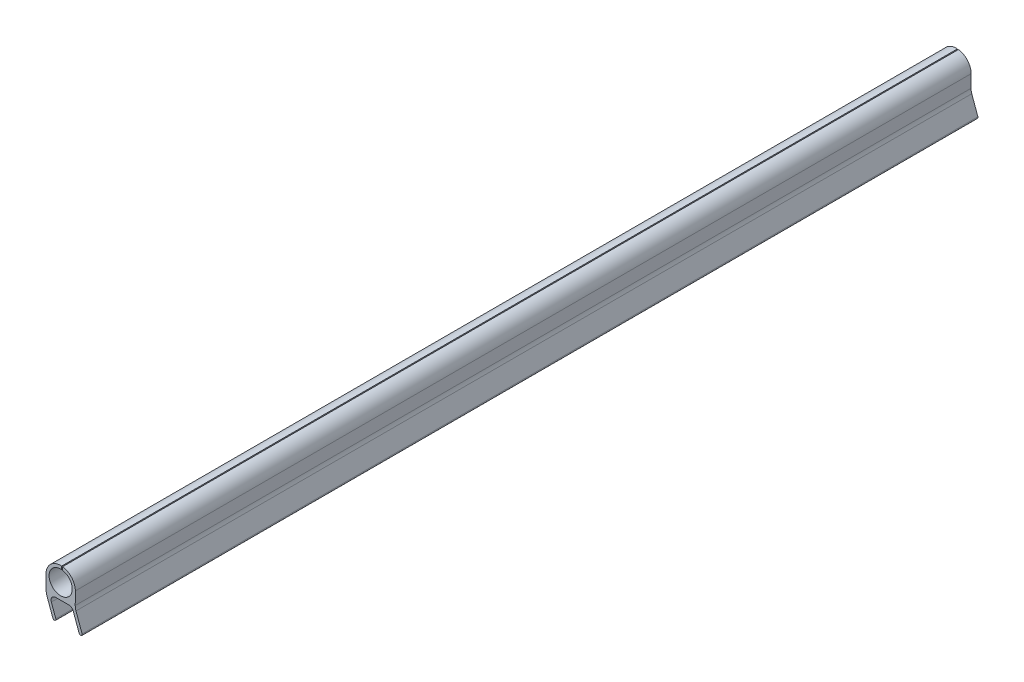
ISO-10303-21;
HEADER;
FILE_DESCRIPTION(('STEP AP214'),'2;1');
FILE_NAME('part.step','',(''),(''),'','','');
FILE_SCHEMA(('AUTOMOTIVE_DESIGN { 1 0 10303 214 1 1 1 1 }'));
ENDSEC;
DATA;
#1=APPLICATION_CONTEXT('core data for automotive mechanical design processes');
#2=APPLICATION_PROTOCOL_DEFINITION('international standard','automotive_design',2000,#1);
#3=PRODUCT_CONTEXT('',#1,'mechanical');
#4=PRODUCT('Part','Part','',(#3));
#5=PRODUCT_RELATED_PRODUCT_CATEGORY('part','',(#4));
#6=PRODUCT_DEFINITION_FORMATION('','',#4);
#7=PRODUCT_DEFINITION_CONTEXT('part definition',#1,'design');
#8=PRODUCT_DEFINITION('design','',#6,#7);
#9=PRODUCT_DEFINITION_SHAPE('','',#8);
#10=(LENGTH_UNIT() NAMED_UNIT(*) SI_UNIT(.MILLI.,.METRE.));
#11=(NAMED_UNIT(*) PLANE_ANGLE_UNIT() SI_UNIT($,.RADIAN.));
#12=(NAMED_UNIT(*) SI_UNIT($,.STERADIAN.) SOLID_ANGLE_UNIT());
#13=UNCERTAINTY_MEASURE_WITH_UNIT(LENGTH_MEASURE(1.E-05),#10,'distance_accuracy_value','');
#14=(GEOMETRIC_REPRESENTATION_CONTEXT(3) GLOBAL_UNCERTAINTY_ASSIGNED_CONTEXT((#13)) GLOBAL_UNIT_ASSIGNED_CONTEXT((#10,
#11,#12)) REPRESENTATION_CONTEXT('',''));
#15=CARTESIAN_POINT('',(0.,0.,0.));
#16=DIRECTION('',(0.,0.,1.));
#17=DIRECTION('',(1.,0.,0.));
#18=AXIS2_PLACEMENT_3D('',#15,#16,#17);
#19=CARTESIAN_POINT('',(0.999999999999999,7.43303437365925,-580.));
#20=DIRECTION('',(0.991071249821234,-0.133333333333333,0.));
#21=DIRECTION('',(0.133333333333333,0.991071249821234,0.));
#22=AXIS2_PLACEMENT_3D('',#19,#20,#21);
#23=PLANE('',#22);
#24=DIRECTION('',(0.133333333333333,0.991071249821234,0.));
#25=VECTOR('',#24,1.);
#26=CARTESIAN_POINT('',(0.999999999999999,7.43303437365925,0.));
#27=LINE('',#26,#25);
#28=CARTESIAN_POINT('',(0.999999999999999,7.43303437365925,0.));
#29=VERTEX_POINT('',#28);
#30=CARTESIAN_POINT('',(1.26666666666667,9.41517687330172,0.));
#31=VERTEX_POINT('',#30);
#32=EDGE_CURVE('E199',#29,#31,#27,.T.);
#33=ORIENTED_EDGE('',*,*,#32,.T.);
#34=DIRECTION('',(0.,0.,1.));
#35=VECTOR('',#34,1.);
#36=CARTESIAN_POINT('',(1.26666666666667,9.41517687330172,-580.));
#37=LINE('',#36,#35);
#38=CARTESIAN_POINT('',(1.26666666666667,9.41517687330172,-580.));
#39=VERTEX_POINT('',#38);
#40=EDGE_CURVE('E45',#39,#31,#37,.T.);
#41=ORIENTED_EDGE('',*,*,#40,.F.);
#42=DIRECTION('',(0.133333333333333,0.991071249821234,0.));
#43=VECTOR('',#42,1.);
#44=CARTESIAN_POINT('',(0.999999999999999,7.43303437365925,-580.));
#45=LINE('',#44,#43);
#46=CARTESIAN_POINT('',(0.999999999999999,7.43303437365925,-580.));
#47=VERTEX_POINT('',#46);
#48=EDGE_CURVE('E126',#47,#39,#45,.T.);
#49=ORIENTED_EDGE('',*,*,#48,.F.);
#50=DIRECTION('',(0.,0.,1.));
#51=VECTOR('',#50,1.);
#52=CARTESIAN_POINT('',(0.999999999999999,7.43303437365925,-580.));
#53=LINE('',#52,#51);
#54=EDGE_CURVE('E11',#47,#29,#53,.T.);
#55=ORIENTED_EDGE('',*,*,#54,.T.);
#56=EDGE_LOOP('',(#33,#41,#49,#55));
#57=FACE_BOUND('',#56,.T.);
#58=ADVANCED_FACE('F37',(#57),#23,.F.);
#59=CARTESIAN_POINT('',(0.,0.,-580.));
#60=DIRECTION('',(0.,0.,1.));
#61=DIRECTION('',(1.,0.,0.));
#62=AXIS2_PLACEMENT_3D('',#59,#60,#61);
#63=CYLINDRICAL_SURFACE('',#62,9.5);
#64=CARTESIAN_POINT('',(0.,0.,0.));
#65=DIRECTION('',(0.,0.,1.));
#66=DIRECTION('',(1.,0.,0.));
#67=AXIS2_PLACEMENT_3D('',#64,#65,#66);
#68=CIRCLE('',#67,9.5);
#69=CARTESIAN_POINT('',(9.5,0.,0.));
#70=VERTEX_POINT('',#69);
#71=EDGE_CURVE('E202',#70,#31,#68,.T.);
#72=ORIENTED_EDGE('',*,*,#71,.F.);
#73=DIRECTION('',(0.,0.,1.));
#74=VECTOR('',#73,1.);
#75=CARTESIAN_POINT('',(9.5,0.,-580.));
#76=LINE('',#75,#74);
#77=CARTESIAN_POINT('',(9.5,0.,-580.));
#78=VERTEX_POINT('',#77);
#79=EDGE_CURVE('E272',#78,#70,#76,.T.);
#80=ORIENTED_EDGE('',*,*,#79,.F.);
#81=CARTESIAN_POINT('',(0.,0.,-580.));
#82=DIRECTION('',(0.,0.,1.));
#83=DIRECTION('',(1.,0.,0.));
#84=AXIS2_PLACEMENT_3D('',#81,#82,#83);
#85=CIRCLE('',#84,9.5);
#86=EDGE_CURVE('E278',#78,#39,#85,.T.);
#87=ORIENTED_EDGE('',*,*,#86,.T.);
#88=ORIENTED_EDGE('',*,*,#40,.T.);
#89=EDGE_LOOP('',(#72,#80,#87,#88));
#90=FACE_BOUND('',#89,.T.);
#91=ADVANCED_FACE('F276',(#90),#63,.T.);
#92=CARTESIAN_POINT('',(9.5,0.,-580.));
#93=DIRECTION('',(-0.999958713731826,0.00908684938755917,0.));
#94=DIRECTION('',(-0.00908684938755917,-0.999958713731826,0.));
#95=AXIS2_PLACEMENT_3D('',#92,#93,#94);
#96=PLANE('',#95);
#97=DIRECTION('',(-0.00908684938755917,-0.999958713731826,0.));
#98=VECTOR('',#97,1.);
#99=CARTESIAN_POINT('',(9.5,0.,0.));
#100=LINE('',#99,#98);
#101=CARTESIAN_POINT('',(9.42515407329102,-8.23639012906368,0.));
#102=VERTEX_POINT('',#101);
#103=EDGE_CURVE('E205',#70,#102,#100,.T.);
#104=ORIENTED_EDGE('',*,*,#103,.T.);
#105=DIRECTION('',(0.,0.,1.));
#106=VECTOR('',#105,1.);
#107=CARTESIAN_POINT('',(9.42515407329102,-8.23639012906368,-580.));
#108=LINE('',#107,#106);
#109=CARTESIAN_POINT('',(9.42515407329102,-8.23639012906368,-580.));
#110=VERTEX_POINT('',#109);
#111=EDGE_CURVE('E269',#110,#102,#108,.T.);
#112=ORIENTED_EDGE('',*,*,#111,.F.);
#113=DIRECTION('',(-0.00908684938755917,-0.999958713731826,0.));
#114=VECTOR('',#113,1.);
#115=CARTESIAN_POINT('',(9.5,0.,-580.));
#116=LINE('',#115,#114);
#117=EDGE_CURVE('E294',#78,#110,#116,.T.);
#118=ORIENTED_EDGE('',*,*,#117,.F.);
#119=ORIENTED_EDGE('',*,*,#79,.T.);
#120=EDGE_LOOP('',(#104,#112,#118,#119));
#121=FACE_BOUND('',#120,.T.);
#122=ADVANCED_FACE('F285',(#121),#96,.F.);
#123=CARTESIAN_POINT('',(17.4248237831456,-8.30908492416416,-580.));
#124=DIRECTION('',(0.,0.,1.));
#125=DIRECTION('',(1.,0.,0.));
#126=AXIS2_PLACEMENT_3D('',#123,#124,#125);
#127=CYLINDRICAL_SURFACE('',#126,8.);
#128=CARTESIAN_POINT('',(17.4248237831456,-8.30908492416416,0.));
#129=DIRECTION('',(0.,0.,1.));
#130=DIRECTION('',(1.,0.,0.));
#131=AXIS2_PLACEMENT_3D('',#128,#129,#130);
#132=CIRCLE('',#131,8.);
#133=CARTESIAN_POINT('',(9.90728281685836,-11.0452460707695,0.));
#134=VERTEX_POINT('',#133);
#135=EDGE_CURVE('E207',#102,#134,#132,.T.);
#136=ORIENTED_EDGE('',*,*,#135,.T.);
#137=DIRECTION('',(0.,0.,1.));
#138=VECTOR('',#137,1.);
#139=CARTESIAN_POINT('',(9.90728281685836,-11.0452460707695,-580.));
#140=LINE('',#139,#138);
#141=CARTESIAN_POINT('',(9.90728281685836,-11.0452460707695,-580.));
#142=VERTEX_POINT('',#141);
#143=EDGE_CURVE('E266',#142,#134,#140,.T.);
#144=ORIENTED_EDGE('',*,*,#143,.F.);
#145=CARTESIAN_POINT('',(17.4248237831456,-8.30908492416416,-580.));
#146=DIRECTION('',(0.,0.,1.));
#147=DIRECTION('',(1.,0.,0.));
#148=AXIS2_PLACEMENT_3D('',#145,#146,#147);
#149=CIRCLE('',#148,8.);
#150=EDGE_CURVE('E291',#110,#142,#149,.T.);
#151=ORIENTED_EDGE('',*,*,#150,.F.);
#152=ORIENTED_EDGE('',*,*,#111,.T.);
#153=EDGE_LOOP('',(#136,#144,#151,#152));
#154=FACE_BOUND('',#153,.T.);
#155=ADVANCED_FACE('F289',(#154),#127,.F.);
#156=CARTESIAN_POINT('',(9.90728281685836,-11.0452460707695,-580.));
#157=DIRECTION('',(-0.939692620785908,-0.342020143325671,0.));
#158=DIRECTION('',(0.342020143325671,-0.939692620785908,0.));
#159=AXIS2_PLACEMENT_3D('',#156,#157,#158);
#160=PLANE('',#159);
#161=DIRECTION('',(0.342020143325671,-0.939692620785908,0.));
#162=VECTOR('',#161,1.);
#163=CARTESIAN_POINT('',(9.90728281685836,-11.0452460707695,0.));
#164=LINE('',#163,#162);
#165=CARTESIAN_POINT('',(13.878210447752,-21.9552800709382,0.));
#166=VERTEX_POINT('',#165);
#167=EDGE_CURVE('E209',#134,#166,#164,.T.);
#168=ORIENTED_EDGE('',*,*,#167,.T.);
#169=DIRECTION('',(0.,0.,1.));
#170=VECTOR('',#169,1.);
#171=CARTESIAN_POINT('',(13.878210447752,-21.9552800709382,-580.));
#172=LINE('',#171,#170);
#173=CARTESIAN_POINT('',(13.878210447752,-21.9552800709382,-580.));
#174=VERTEX_POINT('',#173);
#175=EDGE_CURVE('E264',#174,#166,#172,.T.);
#176=ORIENTED_EDGE('',*,*,#175,.F.);
#177=DIRECTION('',(0.342020143325671,-0.939692620785908,0.));
#178=VECTOR('',#177,1.);
#179=CARTESIAN_POINT('',(9.90728281685836,-11.0452460707695,-580.));
#180=LINE('',#179,#178);
#181=EDGE_CURVE('E293',#142,#174,#180,.T.);
#182=ORIENTED_EDGE('',*,*,#181,.F.);
#183=ORIENTED_EDGE('',*,*,#143,.T.);
#184=EDGE_LOOP('',(#168,#176,#182,#183));
#185=FACE_BOUND('',#184,.T.);
#186=ADVANCED_FACE('F347',(#185),#160,.F.);
#187=CARTESIAN_POINT('',(12.9385178269661,-22.2973002142639,-580.));
#188=DIRECTION('',(0.,0.,1.));
#189=DIRECTION('',(1.,0.,0.));
#190=AXIS2_PLACEMENT_3D('',#187,#188,#189);
#191=CYLINDRICAL_SURFACE('',#190,1.);
#192=CARTESIAN_POINT('',(12.9385178269661,-22.2973002142639,0.));
#193=DIRECTION('',(0.,0.,1.));
#194=DIRECTION('',(1.,0.,0.));
#195=AXIS2_PLACEMENT_3D('',#192,#193,#194);
#196=CIRCLE('',#195,1.);
#197=CARTESIAN_POINT('',(11.9988252061802,-22.6393203575895,0.));
#198=VERTEX_POINT('',#197);
#199=EDGE_CURVE('E212',#198,#166,#196,.T.);
#200=ORIENTED_EDGE('',*,*,#199,.F.);
#201=DIRECTION('',(0.,0.,1.));
#202=VECTOR('',#201,1.);
#203=CARTESIAN_POINT('',(11.9988252061802,-22.6393203575895,-580.));
#204=LINE('',#203,#202);
#205=CARTESIAN_POINT('',(11.9988252061802,-22.6393203575895,-580.));
#206=VERTEX_POINT('',#205);
#207=EDGE_CURVE('E262',#206,#198,#204,.T.);
#208=ORIENTED_EDGE('',*,*,#207,.F.);
#209=CARTESIAN_POINT('',(12.9385178269661,-22.2973002142639,-580.));
#210=DIRECTION('',(0.,0.,1.));
#211=DIRECTION('',(1.,0.,0.));
#212=AXIS2_PLACEMENT_3D('',#209,#210,#211);
#213=CIRCLE('',#212,1.);
#214=EDGE_CURVE('E296',#206,#174,#213,.T.);
#215=ORIENTED_EDGE('',*,*,#214,.T.);
#216=ORIENTED_EDGE('',*,*,#175,.T.);
#217=EDGE_LOOP('',(#200,#208,#215,#216));
#218=FACE_BOUND('',#217,.T.);
#219=ADVANCED_FACE('F350',(#218),#191,.T.);
#220=CARTESIAN_POINT('',(8.11694406239132,-11.973939570023,-580.));
#221=DIRECTION('',(-0.939692620785908,-0.34202014332567,0.));
#222=DIRECTION('',(0.34202014332567,-0.939692620785908,0.));
#223=AXIS2_PLACEMENT_3D('',#220,#221,#222);
#224=PLANE('',#223);
#225=DIRECTION('',(0.34202014332567,-0.939692620785908,0.));
#226=VECTOR('',#225,1.);
#227=CARTESIAN_POINT('',(8.11694406239132,-11.973939570023,0.));
#228=LINE('',#227,#226);
#229=CARTESIAN_POINT('',(8.11694406239132,-11.973939570023,0.));
#230=VERTEX_POINT('',#229);
#231=EDGE_CURVE('E215',#230,#198,#228,.T.);
#232=ORIENTED_EDGE('',*,*,#231,.F.);
#233=DIRECTION('',(0.,0.,1.));
#234=VECTOR('',#233,1.);
#235=CARTESIAN_POINT('',(8.11694406239132,-11.973939570023,-580.));
#236=LINE('',#235,#234);
#237=CARTESIAN_POINT('',(8.11694406239132,-11.973939570023,-580.));
#238=VERTEX_POINT('',#237);
#239=EDGE_CURVE('E260',#238,#230,#236,.T.);
#240=ORIENTED_EDGE('',*,*,#239,.F.);
#241=DIRECTION('',(0.34202014332567,-0.939692620785908,0.));
#242=VECTOR('',#241,1.);
#243=CARTESIAN_POINT('',(8.11694406239132,-11.973939570023,-580.));
#244=LINE('',#243,#242);
#245=EDGE_CURVE('E303',#238,#206,#244,.T.);
#246=ORIENTED_EDGE('',*,*,#245,.T.);
#247=ORIENTED_EDGE('',*,*,#207,.T.);
#248=EDGE_LOOP('',(#232,#240,#246,#247));
#249=FACE_BOUND('',#248,.T.);
#250=ADVANCED_FACE('F354',(#249),#224,.T.);
#251=CARTESIAN_POINT('',(5.29786620003359,-13.,-580.));
#252=DIRECTION('',(0.,0.,1.));
#253=DIRECTION('',(1.,0.,0.));
#254=AXIS2_PLACEMENT_3D('',#251,#252,#253);
#255=CYLINDRICAL_SURFACE('',#254,3.);
#256=CARTESIAN_POINT('',(5.29786620003359,-13.,0.));
#257=DIRECTION('',(0.,0.,-1.));
#258=DIRECTION('',(-1.,0.,0.));
#259=AXIS2_PLACEMENT_3D('',#256,#257,#258);
#260=CIRCLE('',#259,3.);
#261=CARTESIAN_POINT('',(5.29786620003359,-10.,0.));
#262=VERTEX_POINT('',#261);
#263=EDGE_CURVE('E218',#262,#230,#260,.T.);
#264=ORIENTED_EDGE('',*,*,#263,.F.);
#265=DIRECTION('',(0.,0.,1.));
#266=VECTOR('',#265,1.);
#267=CARTESIAN_POINT('',(5.29786620003359,-10.,-580.));
#268=LINE('',#267,#266);
#269=CARTESIAN_POINT('',(5.29786620003359,-10.,-580.));
#270=VERTEX_POINT('',#269);
#271=EDGE_CURVE('E258',#270,#262,#268,.T.);
#272=ORIENTED_EDGE('',*,*,#271,.F.);
#273=CARTESIAN_POINT('',(5.29786620003359,-13.,-580.));
#274=DIRECTION('',(0.,0.,-1.));
#275=DIRECTION('',(-1.,0.,0.));
#276=AXIS2_PLACEMENT_3D('',#273,#274,#275);
#277=CIRCLE('',#276,3.);
#278=EDGE_CURVE('E306',#270,#238,#277,.T.);
#279=ORIENTED_EDGE('',*,*,#278,.T.);
#280=ORIENTED_EDGE('',*,*,#239,.T.);
#281=EDGE_LOOP('',(#264,#272,#279,#280));
#282=FACE_BOUND('',#281,.T.);
#283=ADVANCED_FACE('F358',(#282),#255,.F.);
#284=CARTESIAN_POINT('',(-3.21555597977371,-10.,-580.));
#285=DIRECTION('',(0.,-1.,0.));
#286=DIRECTION('',(1.,0.,0.));
#287=AXIS2_PLACEMENT_3D('',#284,#285,#286);
#288=PLANE('',#287);
#289=DIRECTION('',(1.,0.,0.));
#290=VECTOR('',#289,1.);
#291=CARTESIAN_POINT('',(-3.21555597977371,-10.,0.));
#292=LINE('',#291,#290);
#293=CARTESIAN_POINT('',(-3.21555597977371,-10.,0.));
#294=VERTEX_POINT('',#293);
#295=EDGE_CURVE('E221',#294,#262,#292,.T.);
#296=ORIENTED_EDGE('',*,*,#295,.F.);
#297=DIRECTION('',(0.,0.,1.));
#298=VECTOR('',#297,1.);
#299=CARTESIAN_POINT('',(-3.21555597977371,-10.,-580.));
#300=LINE('',#299,#298);
#301=CARTESIAN_POINT('',(-3.21555597977371,-10.,-580.));
#302=VERTEX_POINT('',#301);
#303=EDGE_CURVE('E256',#302,#294,#300,.T.);
#304=ORIENTED_EDGE('',*,*,#303,.F.);
#305=DIRECTION('',(1.,0.,0.));
#306=VECTOR('',#305,1.);
#307=CARTESIAN_POINT('',(-3.21555597977371,-10.,-580.));
#308=LINE('',#307,#306);
#309=EDGE_CURVE('E309',#302,#270,#308,.T.);
#310=ORIENTED_EDGE('',*,*,#309,.T.);
#311=ORIENTED_EDGE('',*,*,#271,.T.);
#312=EDGE_LOOP('',(#296,#304,#310,#311));
#313=FACE_BOUND('',#312,.T.);
#314=ADVANCED_FACE('F362',(#313),#288,.T.);
#315=CARTESIAN_POINT('',(-3.21555597977371,-13.,-580.));
#316=DIRECTION('',(0.,0.,1.));
#317=DIRECTION('',(1.,0.,0.));
#318=AXIS2_PLACEMENT_3D('',#315,#316,#317);
#319=CYLINDRICAL_SURFACE('',#318,3.);
#320=CARTESIAN_POINT('',(-3.21555597977371,-13.,0.));
#321=DIRECTION('',(0.,0.,1.));
#322=DIRECTION('',(1.,0.,0.));
#323=AXIS2_PLACEMENT_3D('',#320,#321,#322);
#324=CIRCLE('',#323,3.);
#325=CARTESIAN_POINT('',(-6.03463384213143,-14.026060429977,0.));
#326=VERTEX_POINT('',#325);
#327=EDGE_CURVE('E224',#294,#326,#324,.T.);
#328=ORIENTED_EDGE('',*,*,#327,.T.);
#329=DIRECTION('',(0.,0.,1.));
#330=VECTOR('',#329,1.);
#331=CARTESIAN_POINT('',(-6.03463384213143,-14.026060429977,-580.));
#332=LINE('',#331,#330);
#333=CARTESIAN_POINT('',(-6.03463384213143,-14.026060429977,-580.));
#334=VERTEX_POINT('',#333);
#335=EDGE_CURVE('E253',#334,#326,#332,.T.);
#336=ORIENTED_EDGE('',*,*,#335,.F.);
#337=CARTESIAN_POINT('',(-3.21555597977371,-13.,-580.));
#338=DIRECTION('',(0.,0.,1.));
#339=DIRECTION('',(1.,0.,0.));
#340=AXIS2_PLACEMENT_3D('',#337,#338,#339);
#341=CIRCLE('',#340,3.);
#342=EDGE_CURVE('E312',#302,#334,#341,.T.);
#343=ORIENTED_EDGE('',*,*,#342,.F.);
#344=ORIENTED_EDGE('',*,*,#303,.T.);
#345=EDGE_LOOP('',(#328,#336,#343,#344));
#346=FACE_BOUND('',#345,.T.);
#347=ADVANCED_FACE('F366',(#346),#319,.F.);
#348=CARTESIAN_POINT('',(-6.03463384213143,-14.026060429977,-580.));
#349=DIRECTION('',(-0.939692620785908,-0.342020143325671,0.));
#350=DIRECTION('',(0.342020143325671,-0.939692620785908,0.));
#351=AXIS2_PLACEMENT_3D('',#348,#349,#350);
#352=PLANE('',#351);
#353=DIRECTION('',(0.342020143325671,-0.939692620785908,0.));
#354=VECTOR('',#353,1.);
#355=CARTESIAN_POINT('',(-6.03463384213143,-14.026060429977,0.));
#356=LINE('',#355,#354);
#357=CARTESIAN_POINT('',(-3.1486339118626,-21.9552800709382,0.));
#358=VERTEX_POINT('',#357);
#359=EDGE_CURVE('E226',#326,#358,#356,.T.);
#360=ORIENTED_EDGE('',*,*,#359,.T.);
#361=DIRECTION('',(0.,0.,1.));
#362=VECTOR('',#361,1.);
#363=CARTESIAN_POINT('',(-3.1486339118626,-21.9552800709382,-580.));
#364=LINE('',#363,#362);
#365=CARTESIAN_POINT('',(-3.1486339118626,-21.9552800709382,-580.));
#366=VERTEX_POINT('',#365);
#367=EDGE_CURVE('E250',#366,#358,#364,.T.);
#368=ORIENTED_EDGE('',*,*,#367,.F.);
#369=DIRECTION('',(0.342020143325671,-0.939692620785908,0.));
#370=VECTOR('',#369,1.);
#371=CARTESIAN_POINT('',(-6.03463384213143,-14.026060429977,-580.));
#372=LINE('',#371,#370);
#373=EDGE_CURVE('E314',#334,#366,#372,.T.);
#374=ORIENTED_EDGE('',*,*,#373,.F.);
#375=ORIENTED_EDGE('',*,*,#335,.T.);
#376=EDGE_LOOP('',(#360,#368,#374,#375));
#377=FACE_BOUND('',#376,.T.);
#378=ADVANCED_FACE('F370',(#377),#352,.F.);
#379=CARTESIAN_POINT('',(-4.08832653264851,-22.2973002142639,-580.));
#380=DIRECTION('',(0.,0.,1.));
#381=DIRECTION('',(1.,0.,0.));
#382=AXIS2_PLACEMENT_3D('',#379,#380,#381);
#383=CYLINDRICAL_SURFACE('',#382,1.);
#384=CARTESIAN_POINT('',(-4.08832653264851,-22.2973002142639,0.));
#385=DIRECTION('',(0.,0.,-1.));
#386=DIRECTION('',(-1.,0.,0.));
#387=AXIS2_PLACEMENT_3D('',#384,#385,#386);
#388=CIRCLE('',#387,1.);
#389=CARTESIAN_POINT('',(-5.02801915343441,-22.6393203575895,0.));
#390=VERTEX_POINT('',#389);
#391=EDGE_CURVE('E228',#358,#390,#388,.T.);
#392=ORIENTED_EDGE('',*,*,#391,.T.);
#393=DIRECTION('',(0.,0.,1.));
#394=VECTOR('',#393,1.);
#395=CARTESIAN_POINT('',(-5.02801915343441,-22.6393203575895,-580.));
#396=LINE('',#395,#394);
#397=CARTESIAN_POINT('',(-5.02801915343441,-22.6393203575895,-580.));
#398=VERTEX_POINT('',#397);
#399=EDGE_CURVE('E248',#398,#390,#396,.T.);
#400=ORIENTED_EDGE('',*,*,#399,.F.);
#401=CARTESIAN_POINT('',(-4.08832653264851,-22.2973002142639,-580.));
#402=DIRECTION('',(0.,0.,-1.));
#403=DIRECTION('',(-1.,0.,0.));
#404=AXIS2_PLACEMENT_3D('',#401,#402,#403);
#405=CIRCLE('',#404,1.);
#406=EDGE_CURVE('E316',#366,#398,#405,.T.);
#407=ORIENTED_EDGE('',*,*,#406,.F.);
#408=ORIENTED_EDGE('',*,*,#367,.T.);
#409=EDGE_LOOP('',(#392,#400,#407,#408));
#410=FACE_BOUND('',#409,.T.);
#411=ADVANCED_FACE('F374',(#410),#383,.T.);
#412=CARTESIAN_POINT('',(-8.7763114494309,-12.3409719128235,-580.));
#413=DIRECTION('',(-0.939692620785908,-0.34202014332567,0.));
#414=DIRECTION('',(0.34202014332567,-0.939692620785908,0.));
#415=AXIS2_PLACEMENT_3D('',#412,#413,#414);
#416=PLANE('',#415);
#417=DIRECTION('',(0.34202014332567,-0.939692620785908,0.));
#418=VECTOR('',#417,1.);
#419=CARTESIAN_POINT('',(-8.7763114494309,-12.3409719128235,0.));
#420=LINE('',#419,#418);
#421=CARTESIAN_POINT('',(-8.7763114494309,-12.3409719128235,0.));
#422=VERTEX_POINT('',#421);
#423=EDGE_CURVE('E231',#422,#390,#420,.T.);
#424=ORIENTED_EDGE('',*,*,#423,.F.);
#425=DIRECTION('',(0.,0.,1.));
#426=VECTOR('',#425,1.);
#427=CARTESIAN_POINT('',(-8.7763114494309,-12.3409719128235,-580.));
#428=LINE('',#427,#426);
#429=CARTESIAN_POINT('',(-8.7763114494309,-12.3409719128235,-580.));
#430=VERTEX_POINT('',#429);
#431=EDGE_CURVE('E246',#430,#422,#428,.T.);
#432=ORIENTED_EDGE('',*,*,#431,.F.);
#433=DIRECTION('',(0.34202014332567,-0.939692620785908,0.));
#434=VECTOR('',#433,1.);
#435=CARTESIAN_POINT('',(-8.7763114494309,-12.3409719128235,-580.));
#436=LINE('',#435,#434);
#437=EDGE_CURVE('E318',#430,#398,#436,.T.);
#438=ORIENTED_EDGE('',*,*,#437,.T.);
#439=ORIENTED_EDGE('',*,*,#399,.T.);
#440=EDGE_LOOP('',(#424,#432,#438,#439));
#441=FACE_BOUND('',#440,.T.);
#442=ADVANCED_FACE('F378',(#441),#416,.T.);
#443=CARTESIAN_POINT('',(2.5,-8.23673019291549,-580.));
#444=DIRECTION('',(0.,0.,1.));
#445=DIRECTION('',(1.,0.,0.));
#446=AXIS2_PLACEMENT_3D('',#443,#444,#445);
#447=CYLINDRICAL_SURFACE('',#446,12.);
#448=CARTESIAN_POINT('',(2.5,-8.23673019291549,0.));
#449=DIRECTION('',(0.,0.,1.));
#450=DIRECTION('',(1.,0.,0.));
#451=AXIS2_PLACEMENT_3D('',#448,#449,#450);
#452=CIRCLE('',#451,12.);
#453=CARTESIAN_POINT('',(-9.5,-8.23673019291549,0.));
#454=VERTEX_POINT('',#453);
#455=EDGE_CURVE('E234',#454,#422,#452,.T.);
#456=ORIENTED_EDGE('',*,*,#455,.F.);
#457=DIRECTION('',(0.,0.,1.));
#458=VECTOR('',#457,1.);
#459=CARTESIAN_POINT('',(-9.5,-8.23673019291549,-580.));
#460=LINE('',#459,#458);
#461=CARTESIAN_POINT('',(-9.5,-8.23673019291549,-580.));
#462=VERTEX_POINT('',#461);
#463=EDGE_CURVE('E180',#462,#454,#460,.T.);
#464=ORIENTED_EDGE('',*,*,#463,.F.);
#465=CARTESIAN_POINT('',(2.5,-8.23673019291549,-580.));
#466=DIRECTION('',(0.,0.,1.));
#467=DIRECTION('',(1.,0.,0.));
#468=AXIS2_PLACEMENT_3D('',#465,#466,#467);
#469=CIRCLE('',#468,12.);
#470=EDGE_CURVE('E190',#462,#430,#469,.T.);
#471=ORIENTED_EDGE('',*,*,#470,.T.);
#472=ORIENTED_EDGE('',*,*,#431,.T.);
#473=EDGE_LOOP('',(#456,#464,#471,#472));
#474=FACE_BOUND('',#473,.T.);
#475=ADVANCED_FACE('F322',(#474),#447,.T.);
#476=CARTESIAN_POINT('',(-9.5,0.,-580.));
#477=DIRECTION('',(-1.,0.,0.));
#478=DIRECTION('',(0.,0.,1.));
#479=AXIS2_PLACEMENT_3D('',#476,#477,#478);
#480=PLANE('',#479);
#481=DIRECTION('',(0.,-1.,0.));
#482=VECTOR('',#481,1.);
#483=CARTESIAN_POINT('',(-9.5,0.,0.));
#484=LINE('',#483,#482);
#485=CARTESIAN_POINT('',(-9.5,0.,0.));
#486=VERTEX_POINT('',#485);
#487=EDGE_CURVE('E176',#486,#454,#484,.T.);
#488=ORIENTED_EDGE('',*,*,#487,.F.);
#489=DIRECTION('',(0.,0.,1.));
#490=VECTOR('',#489,1.);
#491=CARTESIAN_POINT('',(-9.5,0.,-580.));
#492=LINE('',#491,#490);
#493=CARTESIAN_POINT('',(-9.5,0.,-580.));
#494=VERTEX_POINT('',#493);
#495=EDGE_CURVE('E171',#494,#486,#492,.T.);
#496=ORIENTED_EDGE('',*,*,#495,.F.);
#497=DIRECTION('',(0.,-1.,0.));
#498=VECTOR('',#497,1.);
#499=CARTESIAN_POINT('',(-9.5,0.,-580.));
#500=LINE('',#499,#498);
#501=EDGE_CURVE('E174',#494,#462,#500,.T.);
#502=ORIENTED_EDGE('',*,*,#501,.T.);
#503=ORIENTED_EDGE('',*,*,#463,.T.);
#504=EDGE_LOOP('',(#488,#496,#502,#503));
#505=FACE_BOUND('',#504,.T.);
#506=ADVANCED_FACE('F173',(#505),#480,.T.);
#507=CARTESIAN_POINT('',(0.,0.,-580.));
#508=DIRECTION('',(0.,0.,1.));
#509=DIRECTION('',(1.,0.,0.));
#510=AXIS2_PLACEMENT_3D('',#507,#508,#509);
#511=CYLINDRICAL_SURFACE('',#510,9.5);
#512=CARTESIAN_POINT('',(0.,0.,0.));
#513=DIRECTION('',(0.,0.,1.));
#514=DIRECTION('',(1.,0.,0.));
#515=AXIS2_PLACEMENT_3D('',#512,#513,#514);
#516=CIRCLE('',#515,9.5);
#517=CARTESIAN_POINT('',(0.636522200804112,9.47865177585312,0.));
#518=VERTEX_POINT('',#517);
#519=EDGE_CURVE('E238',#518,#486,#516,.T.);
#520=ORIENTED_EDGE('',*,*,#519,.F.);
#521=DIRECTION('',(0.,0.,1.));
#522=VECTOR('',#521,1.);
#523=CARTESIAN_POINT('',(0.636522200804112,9.47865177585312,-580.));
#524=LINE('',#523,#522);
#525=CARTESIAN_POINT('',(0.636522200804112,9.47865177585312,-580.));
#526=VERTEX_POINT('',#525);
#527=EDGE_CURVE('E112',#526,#518,#524,.T.);
#528=ORIENTED_EDGE('',*,*,#527,.F.);
#529=CARTESIAN_POINT('',(0.,0.,-580.));
#530=DIRECTION('',(0.,0.,1.));
#531=DIRECTION('',(1.,0.,0.));
#532=AXIS2_PLACEMENT_3D('',#529,#530,#531);
#533=CIRCLE('',#532,9.5);
#534=EDGE_CURVE('E187',#526,#494,#533,.T.);
#535=ORIENTED_EDGE('',*,*,#534,.T.);
#536=ORIENTED_EDGE('',*,*,#495,.T.);
#537=EDGE_LOOP('',(#520,#528,#535,#536));
#538=FACE_BOUND('',#537,.T.);
#539=ADVANCED_FACE('F192',(#538),#511,.T.);
#540=CARTESIAN_POINT('',(0.502517526950615,7.48314613883141,-580.));
#541=DIRECTION('',(0.997752818510855,-0.0670023369267485,0.));
#542=DIRECTION('',(0.0670023369267485,0.997752818510855,0.));
#543=AXIS2_PLACEMENT_3D('',#540,#541,#542);
#544=PLANE('',#543);
#545=DIRECTION('',(0.0670023369267485,0.997752818510855,0.));
#546=VECTOR('',#545,1.);
#547=CARTESIAN_POINT('',(0.502517526950615,7.48314613883141,0.));
#548=LINE('',#547,#546);
#549=CARTESIAN_POINT('',(0.502517526950615,7.48314613883141,0.));
#550=VERTEX_POINT('',#549);
#551=EDGE_CURVE('E240',#550,#518,#548,.T.);
#552=ORIENTED_EDGE('',*,*,#551,.F.);
#553=DIRECTION('',(0.,0.,1.));
#554=VECTOR('',#553,1.);
#555=CARTESIAN_POINT('',(0.502517526950615,7.48314613883141,-580.));
#556=LINE('',#555,#554);
#557=CARTESIAN_POINT('',(0.502517526950615,7.48314613883141,-580.));
#558=VERTEX_POINT('',#557);
#559=EDGE_CURVE('E195',#558,#550,#556,.T.);
#560=ORIENTED_EDGE('',*,*,#559,.F.);
#561=DIRECTION('',(0.0670023369267485,0.997752818510855,0.));
#562=VECTOR('',#561,1.);
#563=CARTESIAN_POINT('',(0.502517526950615,7.48314613883141,-580.));
#564=LINE('',#563,#562);
#565=EDGE_CURVE('E193',#558,#526,#564,.T.);
#566=ORIENTED_EDGE('',*,*,#565,.T.);
#567=ORIENTED_EDGE('',*,*,#527,.T.);
#568=EDGE_LOOP('',(#552,#560,#566,#567));
#569=FACE_BOUND('',#568,.T.);
#570=ADVANCED_FACE('F324',(#569),#544,.T.);
#571=CARTESIAN_POINT('',(0.,0.,-580.));
#572=DIRECTION('',(0.,0.,1.));
#573=DIRECTION('',(1.,0.,0.));
#574=AXIS2_PLACEMENT_3D('',#571,#572,#573);
#575=CYLINDRICAL_SURFACE('',#574,7.5);
#576=CARTESIAN_POINT('',(0.,0.,0.));
#577=DIRECTION('',(0.,0.,-1.));
#578=DIRECTION('',(-1.,0.,0.));
#579=AXIS2_PLACEMENT_3D('',#576,#577,#578);
#580=CIRCLE('',#579,7.5);
#581=EDGE_CURVE('E119',#29,#550,#580,.T.);
#582=ORIENTED_EDGE('',*,*,#581,.F.);
#583=ORIENTED_EDGE('',*,*,#54,.F.);
#584=CARTESIAN_POINT('',(0.,0.,-580.));
#585=DIRECTION('',(0.,0.,1.));
#586=DIRECTION('',(1.,0.,0.));
#587=AXIS2_PLACEMENT_3D('',#584,#585,#586);
#588=CIRCLE('',#587,7.5);
#589=EDGE_CURVE('E53',#558,#47,#588,.T.);
#590=ORIENTED_EDGE('',*,*,#589,.F.);
#591=ORIENTED_EDGE('',*,*,#559,.T.);
#592=EDGE_LOOP('',(#582,#583,#590,#591));
#593=FACE_BOUND('',#592,.T.);
#594=ADVANCED_FACE('F326',(#593),#575,.F.);
#595=CARTESIAN_POINT('',(0.,0.,-580.));
#596=DIRECTION('',(0.,0.,1.));
#597=DIRECTION('',(1.,0.,0.));
#598=AXIS2_PLACEMENT_3D('',#595,#596,#597);
#599=PLANE('',#598);
#600=ORIENTED_EDGE('',*,*,#589,.T.);
#601=ORIENTED_EDGE('',*,*,#48,.T.);
#602=ORIENTED_EDGE('',*,*,#86,.F.);
#603=ORIENTED_EDGE('',*,*,#117,.T.);
#604=ORIENTED_EDGE('',*,*,#150,.T.);
#605=ORIENTED_EDGE('',*,*,#181,.T.);
#606=ORIENTED_EDGE('',*,*,#214,.F.);
#607=ORIENTED_EDGE('',*,*,#245,.F.);
#608=ORIENTED_EDGE('',*,*,#278,.F.);
#609=ORIENTED_EDGE('',*,*,#309,.F.);
#610=ORIENTED_EDGE('',*,*,#342,.T.);
#611=ORIENTED_EDGE('',*,*,#373,.T.);
#612=ORIENTED_EDGE('',*,*,#406,.T.);
#613=ORIENTED_EDGE('',*,*,#437,.F.);
#614=ORIENTED_EDGE('',*,*,#470,.F.);
#615=ORIENTED_EDGE('',*,*,#501,.F.);
#616=ORIENTED_EDGE('',*,*,#534,.F.);
#617=ORIENTED_EDGE('',*,*,#565,.F.);
#618=EDGE_LOOP('',(#600,#601,#602,#603,#604,#605,#606,#607,#608,#609,#610,#611,#612,#613,#614,
#615,#616,#617));
#619=FACE_BOUND('',#618,.T.);
#620=ADVANCED_FACE('F185',(#619),#599,.F.);
#621=CARTESIAN_POINT('',(0.,0.,0.));
#622=DIRECTION('',(0.,0.,1.));
#623=DIRECTION('',(1.,0.,0.));
#624=AXIS2_PLACEMENT_3D('',#621,#622,#623);
#625=PLANE('',#624);
#626=ORIENTED_EDGE('',*,*,#32,.F.);
#627=ORIENTED_EDGE('',*,*,#581,.T.);
#628=ORIENTED_EDGE('',*,*,#551,.T.);
#629=ORIENTED_EDGE('',*,*,#519,.T.);
#630=ORIENTED_EDGE('',*,*,#487,.T.);
#631=ORIENTED_EDGE('',*,*,#455,.T.);
#632=ORIENTED_EDGE('',*,*,#423,.T.);
#633=ORIENTED_EDGE('',*,*,#391,.F.);
#634=ORIENTED_EDGE('',*,*,#359,.F.);
#635=ORIENTED_EDGE('',*,*,#327,.F.);
#636=ORIENTED_EDGE('',*,*,#295,.T.);
#637=ORIENTED_EDGE('',*,*,#263,.T.);
#638=ORIENTED_EDGE('',*,*,#231,.T.);
#639=ORIENTED_EDGE('',*,*,#199,.T.);
#640=ORIENTED_EDGE('',*,*,#167,.F.);
#641=ORIENTED_EDGE('',*,*,#135,.F.);
#642=ORIENTED_EDGE('',*,*,#103,.F.);
#643=ORIENTED_EDGE('',*,*,#71,.T.);
#644=EDGE_LOOP('',(#626,#627,#628,#629,#630,#631,#632,#633,#634,#635,#636,#637,#638,#639,#640,
#641,#642,#643));
#645=FACE_BOUND('',#644,.T.);
#646=ADVANCED_FACE('F280',(#645),#625,.T.);
#647=CLOSED_SHELL('',(#58,#91,#122,#155,#186,#219,#250,#283,#314,#347,#378,#411,#442,#475,#506,
#539,#570,#594,#620,#646));
#648=MANIFOLD_SOLID_BREP('B2',#647);
#649=ADVANCED_BREP_SHAPE_REPRESENTATION('',(#18,#648),#14);
#650=SHAPE_DEFINITION_REPRESENTATION(#9,#649);
ENDSEC;
END-ISO-10303-21;
